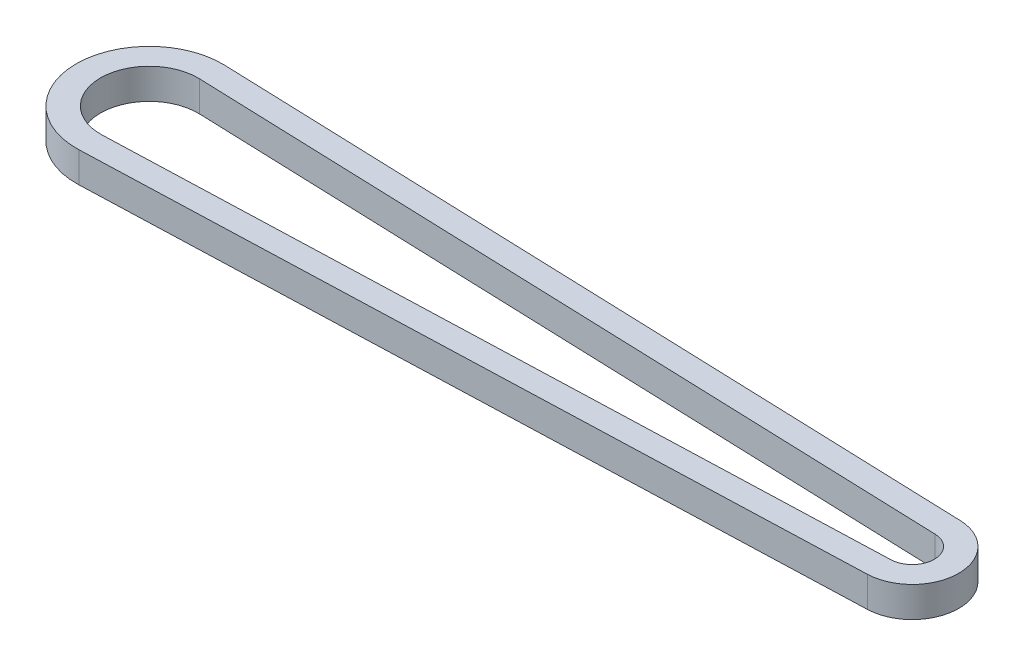
ISO-10303-21;
HEADER;
FILE_DESCRIPTION(('STEP AP214'),'2;1');
FILE_NAME('part.step','',(''),(''),'','','');
FILE_SCHEMA(('AUTOMOTIVE_DESIGN { 1 0 10303 214 1 1 1 1 }'));
ENDSEC;
DATA;
#1=APPLICATION_CONTEXT('core data for automotive mechanical design processes');
#2=APPLICATION_PROTOCOL_DEFINITION('international standard','automotive_design',2000,#1);
#3=PRODUCT_CONTEXT('',#1,'mechanical');
#4=PRODUCT('Part','Part','',(#3));
#5=PRODUCT_RELATED_PRODUCT_CATEGORY('part','',(#4));
#6=PRODUCT_DEFINITION_FORMATION('','',#4);
#7=PRODUCT_DEFINITION_CONTEXT('part definition',#1,'design');
#8=PRODUCT_DEFINITION('design','',#6,#7);
#9=PRODUCT_DEFINITION_SHAPE('','',#8);
#10=(LENGTH_UNIT() NAMED_UNIT(*) SI_UNIT(.MILLI.,.METRE.));
#11=(NAMED_UNIT(*) PLANE_ANGLE_UNIT() SI_UNIT($,.RADIAN.));
#12=(NAMED_UNIT(*) SI_UNIT($,.STERADIAN.) SOLID_ANGLE_UNIT());
#13=UNCERTAINTY_MEASURE_WITH_UNIT(LENGTH_MEASURE(1.E-05),#10,'distance_accuracy_value','');
#14=(GEOMETRIC_REPRESENTATION_CONTEXT(3) GLOBAL_UNCERTAINTY_ASSIGNED_CONTEXT((#13)) GLOBAL_UNIT_ASSIGNED_CONTEXT((#10,
#11,#12)) REPRESENTATION_CONTEXT('',''));
#15=CARTESIAN_POINT('',(0.,0.,0.));
#16=DIRECTION('',(0.,0.,1.));
#17=DIRECTION('',(1.,0.,0.));
#18=AXIS2_PLACEMENT_3D('',#15,#16,#17);
#19=CARTESIAN_POINT('',(313.2,12.5,0.));
#20=DIRECTION('',(0.,1.,0.));
#21=DIRECTION('',(0.,0.,1.));
#22=AXIS2_PLACEMENT_3D('',#19,#20,#21);
#23=PLANE('',#22);
#24=CARTESIAN_POINT('',(313.2,12.5,0.));
#25=DIRECTION('',(0.,1.,0.));
#26=DIRECTION('',(1.,0.,0.));
#27=AXIS2_PLACEMENT_3D('',#24,#25,#26);
#28=CIRCLE('',#27,19.0909090909091);
#29=CARTESIAN_POINT('',(313.864956777809,12.5,19.0793249985685));
#30=VERTEX_POINT('',#29);
#31=CARTESIAN_POINT('',(313.86495677781,12.5,-19.0793249985685));
#32=VERTEX_POINT('',#31);
#33=EDGE_CURVE('E162',#30,#32,#28,.T.);
#34=ORIENTED_EDGE('',*,*,#33,.T.);
#35=DIRECTION('',(-0.999393214210731,0.,-0.0348310693138279));
#36=VECTOR('',#35,1.);
#37=CARTESIAN_POINT('',(1.04493207941484,12.5,-29.9817964263219));
#38=LINE('',#37,#36);
#39=CARTESIAN_POINT('',(1.04493207941484,12.5,-29.9817964263219));
#40=VERTEX_POINT('',#39);
#41=EDGE_CURVE('E165',#32,#40,#38,.T.);
#42=ORIENTED_EDGE('',*,*,#41,.T.);
#43=CARTESIAN_POINT('',(0.,12.5,0.));
#44=DIRECTION('',(0.,1.,0.));
#45=DIRECTION('',(1.,0.,0.));
#46=AXIS2_PLACEMENT_3D('',#43,#44,#45);
#47=CIRCLE('',#46,30.);
#48=CARTESIAN_POINT('',(1.04493207941485,12.5,29.9817964263219));
#49=VERTEX_POINT('',#48);
#50=EDGE_CURVE('E168',#40,#49,#47,.T.);
#51=ORIENTED_EDGE('',*,*,#50,.T.);
#52=DIRECTION('',(0.999393214210731,0.,-0.034831069313828));
#53=VECTOR('',#52,1.);
#54=CARTESIAN_POINT('',(313.864956777809,12.5,19.0793249985685));
#55=LINE('',#54,#53);
#56=EDGE_CURVE('E170',#49,#30,#55,.T.);
#57=ORIENTED_EDGE('',*,*,#56,.T.);
#58=EDGE_LOOP('',(#34,#42,#51,#57));
#59=FACE_BOUND('',#58,.T.);
#60=DIRECTION('',(-0.999393214210731,0.,-0.0348310693138279));
#61=VECTOR('',#60,1.);
#62=CARTESIAN_POINT('',(0.696621386276558,12.5,-19.9878642842146));
#63=LINE('',#62,#61);
#64=CARTESIAN_POINT('',(313.516646084671,12.5,-9.08539285646119));
#65=VERTEX_POINT('',#64);
#66=CARTESIAN_POINT('',(0.696621386276558,12.5,-19.9878642842146));
#67=VERTEX_POINT('',#66);
#68=EDGE_CURVE('E134',#65,#67,#63,.T.);
#69=ORIENTED_EDGE('',*,*,#68,.F.);
#70=CARTESIAN_POINT('',(313.2,12.5,0.));
#71=DIRECTION('',(0.,1.,0.));
#72=DIRECTION('',(0.,0.,1.));
#73=AXIS2_PLACEMENT_3D('',#70,#71,#72);
#74=CIRCLE('',#73,9.09090909090909);
#75=CARTESIAN_POINT('',(313.516646084671,12.5,9.08539285646119));
#76=VERTEX_POINT('',#75);
#77=EDGE_CURVE('E126',#76,#65,#74,.T.);
#78=ORIENTED_EDGE('',*,*,#77,.F.);
#79=DIRECTION('',(0.999393214210731,0.,-0.034831069313828));
#80=VECTOR('',#79,1.);
#81=CARTESIAN_POINT('',(313.516646084671,12.5,9.08539285646119));
#82=LINE('',#81,#80);
#83=CARTESIAN_POINT('',(0.696621386276519,12.5,19.9878642842146));
#84=VERTEX_POINT('',#83);
#85=EDGE_CURVE('E148',#84,#76,#82,.T.);
#86=ORIENTED_EDGE('',*,*,#85,.F.);
#87=CARTESIAN_POINT('',(0.,12.5,0.));
#88=DIRECTION('',(0.,1.,0.));
#89=DIRECTION('',(0.,0.,1.));
#90=AXIS2_PLACEMENT_3D('',#87,#88,#89);
#91=CIRCLE('',#90,20.);
#92=EDGE_CURVE('E146',#67,#84,#91,.T.);
#93=ORIENTED_EDGE('',*,*,#92,.F.);
#94=EDGE_LOOP('',(#69,#78,#86,#93));
#95=FACE_BOUND('',#94,.T.);
#96=ADVANCED_FACE('F61',(#59,#95),#23,.T.);
#97=CARTESIAN_POINT('',(313.2,0.,0.));
#98=DIRECTION('',(0.,1.,0.));
#99=DIRECTION('',(0.,0.,1.));
#100=AXIS2_PLACEMENT_3D('',#97,#98,#99);
#101=PLANE('',#100);
#102=CARTESIAN_POINT('',(313.2,0.,0.));
#103=DIRECTION('',(0.,1.,0.));
#104=DIRECTION('',(1.,0.,0.));
#105=AXIS2_PLACEMENT_3D('',#102,#103,#104);
#106=CIRCLE('',#105,19.0909090909091);
#107=CARTESIAN_POINT('',(313.864956777809,0.,19.0793249985685));
#108=VERTEX_POINT('',#107);
#109=CARTESIAN_POINT('',(313.86495677781,0.,-19.0793249985685));
#110=VERTEX_POINT('',#109);
#111=EDGE_CURVE('E142',#108,#110,#106,.T.);
#112=ORIENTED_EDGE('',*,*,#111,.F.);
#113=DIRECTION('',(0.999393214210731,0.,-0.034831069313828));
#114=VECTOR('',#113,1.);
#115=CARTESIAN_POINT('',(313.864956777809,0.,19.0793249985685));
#116=LINE('',#115,#114);
#117=CARTESIAN_POINT('',(1.04493207941485,0.,29.9817964263219));
#118=VERTEX_POINT('',#117);
#119=EDGE_CURVE('E166',#118,#108,#116,.T.);
#120=ORIENTED_EDGE('',*,*,#119,.F.);
#121=CARTESIAN_POINT('',(0.,0.,0.));
#122=DIRECTION('',(0.,1.,0.));
#123=DIRECTION('',(1.,0.,0.));
#124=AXIS2_PLACEMENT_3D('',#121,#122,#123);
#125=CIRCLE('',#124,30.);
#126=CARTESIAN_POINT('',(1.04493207941484,0.,-29.9817964263219));
#127=VERTEX_POINT('',#126);
#128=EDGE_CURVE('E177',#127,#118,#125,.T.);
#129=ORIENTED_EDGE('',*,*,#128,.F.);
#130=DIRECTION('',(-0.999393214210731,0.,-0.0348310693138279));
#131=VECTOR('',#130,1.);
#132=CARTESIAN_POINT('',(1.04493207941484,0.,-29.9817964263219));
#133=LINE('',#132,#131);
#134=EDGE_CURVE('E175',#110,#127,#133,.T.);
#135=ORIENTED_EDGE('',*,*,#134,.F.);
#136=EDGE_LOOP('',(#112,#120,#129,#135));
#137=FACE_BOUND('',#136,.T.);
#138=CARTESIAN_POINT('',(313.2,0.,0.));
#139=DIRECTION('',(0.,1.,0.));
#140=DIRECTION('',(0.,0.,1.));
#141=AXIS2_PLACEMENT_3D('',#138,#139,#140);
#142=CIRCLE('',#141,9.09090909090909);
#143=CARTESIAN_POINT('',(313.516646084671,0.,9.08539285646119));
#144=VERTEX_POINT('',#143);
#145=CARTESIAN_POINT('',(313.516646084671,0.,-9.08539285646119));
#146=VERTEX_POINT('',#145);
#147=EDGE_CURVE('E84',#144,#146,#142,.T.);
#148=ORIENTED_EDGE('',*,*,#147,.T.);
#149=DIRECTION('',(-0.999393214210731,0.,-0.0348310693138279));
#150=VECTOR('',#149,1.);
#151=CARTESIAN_POINT('',(0.696621386276558,0.,-19.9878642842146));
#152=LINE('',#151,#150);
#153=CARTESIAN_POINT('',(0.696621386276558,0.,-19.9878642842146));
#154=VERTEX_POINT('',#153);
#155=EDGE_CURVE('E141',#146,#154,#152,.T.);
#156=ORIENTED_EDGE('',*,*,#155,.T.);
#157=CARTESIAN_POINT('',(0.,0.,0.));
#158=DIRECTION('',(0.,1.,0.));
#159=DIRECTION('',(0.,0.,1.));
#160=AXIS2_PLACEMENT_3D('',#157,#158,#159);
#161=CIRCLE('',#160,20.);
#162=CARTESIAN_POINT('',(0.696621386276559,0.,19.9878642842146));
#163=VERTEX_POINT('',#162);
#164=EDGE_CURVE('E154',#154,#163,#161,.T.);
#165=ORIENTED_EDGE('',*,*,#164,.T.);
#166=DIRECTION('',(0.999393214210731,0.,-0.034831069313828));
#167=VECTOR('',#166,1.);
#168=CARTESIAN_POINT('',(313.516646084671,0.,9.08539285646119));
#169=LINE('',#168,#167);
#170=EDGE_CURVE('E135',#163,#144,#169,.T.);
#171=ORIENTED_EDGE('',*,*,#170,.T.);
#172=EDGE_LOOP('',(#148,#156,#165,#171));
#173=FACE_BOUND('',#172,.T.);
#174=ADVANCED_FACE('F195',(#137,#173),#101,.F.);
#175=CARTESIAN_POINT('',(313.2,12.5,0.));
#176=DIRECTION('',(0.,-1.,0.));
#177=DIRECTION('',(0.,0.,-1.));
#178=AXIS2_PLACEMENT_3D('',#175,#176,#177);
#179=CYLINDRICAL_SURFACE('',#178,19.0909090909091);
#180=ORIENTED_EDGE('',*,*,#111,.T.);
#181=DIRECTION('',(0.,-1.,0.));
#182=VECTOR('',#181,1.);
#183=CARTESIAN_POINT('',(313.86495677781,12.5,-19.0793249985685));
#184=LINE('',#183,#182);
#185=EDGE_CURVE('E12',#32,#110,#184,.T.);
#186=ORIENTED_EDGE('',*,*,#185,.F.);
#187=ORIENTED_EDGE('',*,*,#33,.F.);
#188=DIRECTION('',(0.,-1.,0.));
#189=VECTOR('',#188,1.);
#190=CARTESIAN_POINT('',(313.864956777809,12.5,19.0793249985685));
#191=LINE('',#190,#189);
#192=EDGE_CURVE('E172',#30,#108,#191,.T.);
#193=ORIENTED_EDGE('',*,*,#192,.T.);
#194=EDGE_LOOP('',(#180,#186,#187,#193));
#195=FACE_BOUND('',#194,.T.);
#196=ADVANCED_FACE('F63',(#195),#179,.T.);
#197=CARTESIAN_POINT('',(1.04493207941484,12.5,-29.9817964263219));
#198=DIRECTION('',(-0.0348310693138279,0.,0.999393214210731));
#199=DIRECTION('',(0.999393214210731,0.,0.0348310693138279));
#200=AXIS2_PLACEMENT_3D('',#197,#198,#199);
#201=PLANE('',#200);
#202=ORIENTED_EDGE('',*,*,#134,.T.);
#203=DIRECTION('',(0.,-1.,0.));
#204=VECTOR('',#203,1.);
#205=CARTESIAN_POINT('',(1.04493207941484,12.5,-29.9817964263219));
#206=LINE('',#205,#204);
#207=EDGE_CURVE('E69',#40,#127,#206,.T.);
#208=ORIENTED_EDGE('',*,*,#207,.F.);
#209=ORIENTED_EDGE('',*,*,#41,.F.);
#210=ORIENTED_EDGE('',*,*,#185,.T.);
#211=EDGE_LOOP('',(#202,#208,#209,#210));
#212=FACE_BOUND('',#211,.T.);
#213=ADVANCED_FACE('F205',(#212),#201,.F.);
#214=CARTESIAN_POINT('',(0.,12.5,0.));
#215=DIRECTION('',(0.,-1.,0.));
#216=DIRECTION('',(0.,0.,-1.));
#217=AXIS2_PLACEMENT_3D('',#214,#215,#216);
#218=CYLINDRICAL_SURFACE('',#217,30.);
#219=ORIENTED_EDGE('',*,*,#128,.T.);
#220=DIRECTION('',(0.,-1.,0.));
#221=VECTOR('',#220,1.);
#222=CARTESIAN_POINT('',(1.04493207941485,12.5,29.9817964263219));
#223=LINE('',#222,#221);
#224=EDGE_CURVE('E182',#49,#118,#223,.T.);
#225=ORIENTED_EDGE('',*,*,#224,.F.);
#226=ORIENTED_EDGE('',*,*,#50,.F.);
#227=ORIENTED_EDGE('',*,*,#207,.T.);
#228=EDGE_LOOP('',(#219,#225,#226,#227));
#229=FACE_BOUND('',#228,.T.);
#230=ADVANCED_FACE('F189',(#229),#218,.T.);
#231=CARTESIAN_POINT('',(313.864956777809,12.5,19.0793249985685));
#232=DIRECTION('',(-0.034831069313828,0.,-0.999393214210731));
#233=DIRECTION('',(-0.999393214210731,0.,0.034831069313828));
#234=AXIS2_PLACEMENT_3D('',#231,#232,#233);
#235=PLANE('',#234);
#236=ORIENTED_EDGE('',*,*,#119,.T.);
#237=ORIENTED_EDGE('',*,*,#192,.F.);
#238=ORIENTED_EDGE('',*,*,#56,.F.);
#239=ORIENTED_EDGE('',*,*,#224,.T.);
#240=EDGE_LOOP('',(#236,#237,#238,#239));
#241=FACE_BOUND('',#240,.T.);
#242=ADVANCED_FACE('F199',(#241),#235,.F.);
#243=CARTESIAN_POINT('',(313.2,12.5,0.));
#244=DIRECTION('',(0.,-1.,0.));
#245=DIRECTION('',(0.,0.,-1.));
#246=AXIS2_PLACEMENT_3D('',#243,#244,#245);
#247=CYLINDRICAL_SURFACE('',#246,9.09090909090909);
#248=ORIENTED_EDGE('',*,*,#147,.F.);
#249=DIRECTION('',(0.,-1.,0.));
#250=VECTOR('',#249,1.);
#251=CARTESIAN_POINT('',(313.516646084671,12.5,9.08539285646119));
#252=LINE('',#251,#250);
#253=EDGE_CURVE('E130',#76,#144,#252,.T.);
#254=ORIENTED_EDGE('',*,*,#253,.F.);
#255=ORIENTED_EDGE('',*,*,#77,.T.);
#256=DIRECTION('',(0.,-1.,0.));
#257=VECTOR('',#256,1.);
#258=CARTESIAN_POINT('',(313.516646084671,12.5,-9.08539285646119));
#259=LINE('',#258,#257);
#260=EDGE_CURVE('E129',#65,#146,#259,.T.);
#261=ORIENTED_EDGE('',*,*,#260,.T.);
#262=EDGE_LOOP('',(#248,#254,#255,#261));
#263=FACE_BOUND('',#262,.T.);
#264=ADVANCED_FACE('F128',(#263),#247,.F.);
#265=CARTESIAN_POINT('',(0.696621386276558,12.5,-19.9878642842146));
#266=DIRECTION('',(-0.0348310693138279,0.,0.999393214210731));
#267=DIRECTION('',(0.999393214210731,0.,0.0348310693138279));
#268=AXIS2_PLACEMENT_3D('',#265,#266,#267);
#269=PLANE('',#268);
#270=ORIENTED_EDGE('',*,*,#155,.F.);
#271=ORIENTED_EDGE('',*,*,#260,.F.);
#272=ORIENTED_EDGE('',*,*,#68,.T.);
#273=DIRECTION('',(0.,-1.,0.));
#274=VECTOR('',#273,1.);
#275=CARTESIAN_POINT('',(0.696621386276558,12.5,-19.9878642842146));
#276=LINE('',#275,#274);
#277=EDGE_CURVE('E143',#67,#154,#276,.T.);
#278=ORIENTED_EDGE('',*,*,#277,.T.);
#279=EDGE_LOOP('',(#270,#271,#272,#278));
#280=FACE_BOUND('',#279,.T.);
#281=ADVANCED_FACE('F138',(#280),#269,.T.);
#282=CARTESIAN_POINT('',(0.,12.5,0.));
#283=DIRECTION('',(0.,-1.,0.));
#284=DIRECTION('',(0.,0.,-1.));
#285=AXIS2_PLACEMENT_3D('',#282,#283,#284);
#286=CYLINDRICAL_SURFACE('',#285,20.);
#287=ORIENTED_EDGE('',*,*,#164,.F.);
#288=ORIENTED_EDGE('',*,*,#277,.F.);
#289=ORIENTED_EDGE('',*,*,#92,.T.);
#290=DIRECTION('',(0.,-1.,0.));
#291=VECTOR('',#290,1.);
#292=CARTESIAN_POINT('',(0.696621386276559,12.5,19.9878642842146));
#293=LINE('',#292,#291);
#294=EDGE_CURVE('E76',#84,#163,#293,.T.);
#295=ORIENTED_EDGE('',*,*,#294,.T.);
#296=EDGE_LOOP('',(#287,#288,#289,#295));
#297=FACE_BOUND('',#296,.T.);
#298=ADVANCED_FACE('F228',(#297),#286,.F.);
#299=CARTESIAN_POINT('',(313.516646084671,12.5,9.08539285646119));
#300=DIRECTION('',(-0.034831069313828,0.,-0.999393214210731));
#301=DIRECTION('',(-0.999393214210731,0.,0.034831069313828));
#302=AXIS2_PLACEMENT_3D('',#299,#300,#301);
#303=PLANE('',#302);
#304=ORIENTED_EDGE('',*,*,#170,.F.);
#305=ORIENTED_EDGE('',*,*,#294,.F.);
#306=ORIENTED_EDGE('',*,*,#85,.T.);
#307=ORIENTED_EDGE('',*,*,#253,.T.);
#308=EDGE_LOOP('',(#304,#305,#306,#307));
#309=FACE_BOUND('',#308,.T.);
#310=ADVANCED_FACE('F232',(#309),#303,.T.);
#311=CLOSED_SHELL('',(#96,#174,#196,#213,#230,#242,#264,#281,#298,#310));
#312=MANIFOLD_SOLID_BREP('B2',#311);
#313=ADVANCED_BREP_SHAPE_REPRESENTATION('',(#18,#312),#14);
#314=SHAPE_DEFINITION_REPRESENTATION(#9,#313);
ENDSEC;
END-ISO-10303-21;
